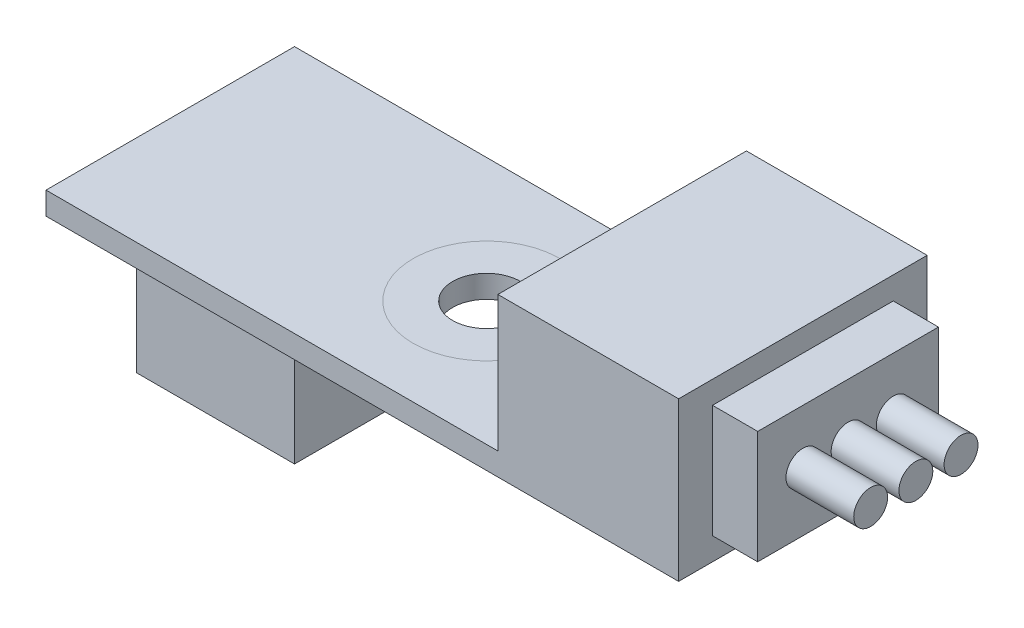
ISO-10303-21;
HEADER;
FILE_DESCRIPTION(('STEP AP214'),'2;1');
FILE_NAME('part.step','',(''),(''),'','','');
FILE_SCHEMA(('AUTOMOTIVE_DESIGN { 1 0 10303 214 1 1 1 1 }'));
ENDSEC;
DATA;
#1=APPLICATION_CONTEXT('core data for automotive mechanical design processes');
#2=APPLICATION_PROTOCOL_DEFINITION('international standard','automotive_design',2000,#1);
#3=PRODUCT_CONTEXT('',#1,'mechanical');
#4=PRODUCT('Part','Part','',(#3));
#5=PRODUCT_RELATED_PRODUCT_CATEGORY('part','',(#4));
#6=PRODUCT_DEFINITION_FORMATION('','',#4);
#7=PRODUCT_DEFINITION_CONTEXT('part definition',#1,'design');
#8=PRODUCT_DEFINITION('design','',#6,#7);
#9=PRODUCT_DEFINITION_SHAPE('','',#8);
#10=(LENGTH_UNIT() NAMED_UNIT(*) SI_UNIT(.MILLI.,.METRE.));
#11=(NAMED_UNIT(*) PLANE_ANGLE_UNIT() SI_UNIT($,.RADIAN.));
#12=(NAMED_UNIT(*) SI_UNIT($,.STERADIAN.) SOLID_ANGLE_UNIT());
#13=UNCERTAINTY_MEASURE_WITH_UNIT(LENGTH_MEASURE(1.E-05),#10,'distance_accuracy_value','');
#14=(GEOMETRIC_REPRESENTATION_CONTEXT(3) GLOBAL_UNCERTAINTY_ASSIGNED_CONTEXT((#13)) GLOBAL_UNIT_ASSIGNED_CONTEXT((#10,
#11,#12)) REPRESENTATION_CONTEXT('',''));
#15=CARTESIAN_POINT('',(0.,0.,0.));
#16=DIRECTION('',(0.,0.,1.));
#17=DIRECTION('',(1.,0.,0.));
#18=AXIS2_PLACEMENT_3D('',#15,#16,#17);
#19=CARTESIAN_POINT('',(14.,1.,0.));
#20=DIRECTION('',(-1.,0.,0.));
#21=DIRECTION('',(0.,0.,1.));
#22=AXIS2_PLACEMENT_3D('',#19,#20,#21);
#23=PLANE('',#22);
#24=DIRECTION('',(0.,0.,-1.));
#25=VECTOR('',#24,1.);
#26=CARTESIAN_POINT('',(14.,0.,0.));
#27=LINE('',#26,#25);
#28=CARTESIAN_POINT('',(14.,0.,5.5));
#29=VERTEX_POINT('',#28);
#30=CARTESIAN_POINT('',(14.,0.,-5.5));
#31=VERTEX_POINT('',#30);
#32=EDGE_CURVE('E263',#29,#31,#27,.T.);
#33=ORIENTED_EDGE('',*,*,#32,.T.);
#34=DIRECTION('',(0.,-1.,0.));
#35=VECTOR('',#34,1.);
#36=CARTESIAN_POINT('',(14.,1.,-5.5));
#37=LINE('',#36,#35);
#38=CARTESIAN_POINT('',(14.,7.,-5.5));
#39=VERTEX_POINT('',#38);
#40=EDGE_CURVE('E283',#39,#31,#37,.T.);
#41=ORIENTED_EDGE('',*,*,#40,.F.);
#42=DIRECTION('',(0.,0.,1.));
#43=VECTOR('',#42,1.);
#44=CARTESIAN_POINT('',(14.,7.,0.));
#45=LINE('',#44,#43);
#46=CARTESIAN_POINT('',(14.,7.,5.5));
#47=VERTEX_POINT('',#46);
#48=EDGE_CURVE('E185',#39,#47,#45,.T.);
#49=ORIENTED_EDGE('',*,*,#48,.T.);
#50=DIRECTION('',(0.,-1.,0.));
#51=VECTOR('',#50,1.);
#52=CARTESIAN_POINT('',(14.,1.,5.5));
#53=LINE('',#52,#51);
#54=EDGE_CURVE('E286',#47,#29,#53,.T.);
#55=ORIENTED_EDGE('',*,*,#54,.T.);
#56=EDGE_LOOP('',(#33,#41,#49,#55));
#57=FACE_BOUND('',#56,.T.);
#58=DIRECTION('',(0.,-1.,0.));
#59=VECTOR('',#58,1.);
#60=CARTESIAN_POINT('',(14.,6.,4.));
#61=LINE('',#60,#59);
#62=CARTESIAN_POINT('',(14.,6.,4.));
#63=VERTEX_POINT('',#62);
#64=CARTESIAN_POINT('',(14.,0.999999999999999,4.));
#65=VERTEX_POINT('',#64);
#66=EDGE_CURVE('E59',#63,#65,#61,.T.);
#67=ORIENTED_EDGE('',*,*,#66,.F.);
#68=DIRECTION('',(0.,0.,1.));
#69=VECTOR('',#68,1.);
#70=CARTESIAN_POINT('',(14.,6.,-4.));
#71=LINE('',#70,#69);
#72=CARTESIAN_POINT('',(14.,6.,-4.));
#73=VERTEX_POINT('',#72);
#74=EDGE_CURVE('E63',#73,#63,#71,.T.);
#75=ORIENTED_EDGE('',*,*,#74,.F.);
#76=DIRECTION('',(0.,1.,0.));
#77=VECTOR('',#76,1.);
#78=CARTESIAN_POINT('',(14.,6.,-4.));
#79=LINE('',#78,#77);
#80=CARTESIAN_POINT('',(14.,1.,-4.));
#81=VERTEX_POINT('',#80);
#82=EDGE_CURVE('E398',#81,#73,#79,.T.);
#83=ORIENTED_EDGE('',*,*,#82,.F.);
#84=DIRECTION('',(0.,0.,-1.));
#85=VECTOR('',#84,1.);
#86=CARTESIAN_POINT('',(14.,1.,-4.));
#87=LINE('',#86,#85);
#88=EDGE_CURVE('E408',#65,#81,#87,.T.);
#89=ORIENTED_EDGE('',*,*,#88,.F.);
#90=EDGE_LOOP('',(#67,#75,#83,#89));
#91=FACE_BOUND('',#90,.T.);
#92=ADVANCED_FACE('F43',(#57,#91),#23,.F.);
#93=CARTESIAN_POINT('',(0.,0.,0.));
#94=DIRECTION('',(0.,1.,0.));
#95=DIRECTION('',(0.,0.,1.));
#96=AXIS2_PLACEMENT_3D('',#93,#94,#95);
#97=PLANE('',#96);
#98=DIRECTION('',(-1.,0.,0.));
#99=VECTOR('',#98,1.);
#100=CARTESIAN_POINT('',(-6.,0.,2.5));
#101=LINE('',#100,#99);
#102=CARTESIAN_POINT('',(-6.,0.,2.5));
#103=VERTEX_POINT('',#102);
#104=CARTESIAN_POINT('',(-13.,0.,2.5));
#105=VERTEX_POINT('',#104);
#106=EDGE_CURVE('E205',#103,#105,#101,.T.);
#107=ORIENTED_EDGE('',*,*,#106,.F.);
#108=DIRECTION('',(0.,0.,-1.));
#109=VECTOR('',#108,1.);
#110=CARTESIAN_POINT('',(-6.,0.,2.5));
#111=LINE('',#110,#109);
#112=CARTESIAN_POINT('',(-6.,0.,-2.5));
#113=VERTEX_POINT('',#112);
#114=EDGE_CURVE('E197',#103,#113,#111,.T.);
#115=ORIENTED_EDGE('',*,*,#114,.T.);
#116=DIRECTION('',(-1.,0.,0.));
#117=VECTOR('',#116,1.);
#118=CARTESIAN_POINT('',(-6.,0.,-2.5));
#119=LINE('',#118,#117);
#120=CARTESIAN_POINT('',(-13.,0.,-2.5));
#121=VERTEX_POINT('',#120);
#122=EDGE_CURVE('E219',#113,#121,#119,.T.);
#123=ORIENTED_EDGE('',*,*,#122,.T.);
#124=DIRECTION('',(0.,0.,-1.));
#125=VECTOR('',#124,1.);
#126=CARTESIAN_POINT('',(-13.,0.,2.5));
#127=LINE('',#126,#125);
#128=EDGE_CURVE('E223',#105,#121,#127,.T.);
#129=ORIENTED_EDGE('',*,*,#128,.F.);
#130=EDGE_LOOP('',(#107,#115,#123,#129));
#131=FACE_BOUND('',#130,.T.);
#132=DIRECTION('',(1.,0.,0.));
#133=VECTOR('',#132,1.);
#134=CARTESIAN_POINT('',(0.,0.,5.5));
#135=LINE('',#134,#133);
#136=CARTESIAN_POINT('',(-14.,0.,5.5));
#137=VERTEX_POINT('',#136);
#138=EDGE_CURVE('E231',#137,#29,#135,.T.);
#139=ORIENTED_EDGE('',*,*,#138,.F.);
#140=DIRECTION('',(0.,0.,-1.));
#141=VECTOR('',#140,1.);
#142=CARTESIAN_POINT('',(-14.,0.,0.));
#143=LINE('',#142,#141);
#144=CARTESIAN_POINT('',(-14.,0.,-5.5));
#145=VERTEX_POINT('',#144);
#146=EDGE_CURVE('E271',#137,#145,#143,.T.);
#147=ORIENTED_EDGE('',*,*,#146,.T.);
#148=DIRECTION('',(1.,0.,0.));
#149=VECTOR('',#148,1.);
#150=CARTESIAN_POINT('',(0.,0.,-5.5));
#151=LINE('',#150,#149);
#152=EDGE_CURVE('E267',#145,#31,#151,.T.);
#153=ORIENTED_EDGE('',*,*,#152,.T.);
#154=ORIENTED_EDGE('',*,*,#32,.F.);
#155=EDGE_LOOP('',(#139,#147,#153,#154));
#156=FACE_BOUND('',#155,.T.);
#157=CARTESIAN_POINT('',(0.,0.,0.));
#158=DIRECTION('',(0.,1.,0.));
#159=DIRECTION('',(0.,0.,1.));
#160=AXIS2_PLACEMENT_3D('',#157,#158,#159);
#161=CIRCLE('',#160,3.25);
#162=CARTESIAN_POINT('',(0.,0.,3.25));
#163=VERTEX_POINT('',#162);
#164=EDGE_CURVE('E291',#163,#163,#161,.F.);
#165=ORIENTED_EDGE('',*,*,#164,.F.);
#166=EDGE_LOOP('',(#165));
#167=FACE_BOUND('',#166,.T.);
#168=ADVANCED_FACE('F326',(#131,#156,#167),#97,.F.);
#169=CARTESIAN_POINT('',(0.,1.,0.));
#170=DIRECTION('',(0.,1.,0.));
#171=DIRECTION('',(0.,0.,1.));
#172=AXIS2_PLACEMENT_3D('',#169,#170,#171);
#173=PLANE('',#172);
#174=DIRECTION('',(0.,0.,-1.));
#175=VECTOR('',#174,1.);
#176=CARTESIAN_POINT('',(6.,1.,0.));
#177=LINE('',#176,#175);
#178=CARTESIAN_POINT('',(6.,1.,5.5));
#179=VERTEX_POINT('',#178);
#180=CARTESIAN_POINT('',(6.,1.,-5.5));
#181=VERTEX_POINT('',#180);
#182=EDGE_CURVE('E168',#179,#181,#177,.T.);
#183=ORIENTED_EDGE('',*,*,#182,.T.);
#184=DIRECTION('',(1.,0.,0.));
#185=VECTOR('',#184,1.);
#186=CARTESIAN_POINT('',(0.,1.,-5.5));
#187=LINE('',#186,#185);
#188=CARTESIAN_POINT('',(-14.,1.,-5.5));
#189=VERTEX_POINT('',#188);
#190=EDGE_CURVE('E246',#189,#181,#187,.T.);
#191=ORIENTED_EDGE('',*,*,#190,.F.);
#192=DIRECTION('',(0.,0.,-1.));
#193=VECTOR('',#192,1.);
#194=CARTESIAN_POINT('',(-14.,1.,0.));
#195=LINE('',#194,#193);
#196=CARTESIAN_POINT('',(-14.,1.,5.5));
#197=VERTEX_POINT('',#196);
#198=EDGE_CURVE('E251',#197,#189,#195,.T.);
#199=ORIENTED_EDGE('',*,*,#198,.F.);
#200=DIRECTION('',(1.,0.,0.));
#201=VECTOR('',#200,1.);
#202=CARTESIAN_POINT('',(0.,1.,5.5));
#203=LINE('',#202,#201);
#204=EDGE_CURVE('E242',#197,#179,#203,.T.);
#205=ORIENTED_EDGE('',*,*,#204,.T.);
#206=EDGE_LOOP('',(#183,#191,#199,#205));
#207=FACE_BOUND('',#206,.T.);
#208=CARTESIAN_POINT('',(0.,1.,0.));
#209=DIRECTION('',(0.,1.,0.));
#210=DIRECTION('',(0.,0.,1.));
#211=AXIS2_PLACEMENT_3D('',#208,#209,#210);
#212=CIRCLE('',#211,3.25);
#213=CARTESIAN_POINT('',(0.,1.,3.25));
#214=VERTEX_POINT('',#213);
#215=EDGE_CURVE('E290',#214,#214,#212,.F.);
#216=ORIENTED_EDGE('',*,*,#215,.T.);
#217=EDGE_LOOP('',(#216));
#218=FACE_BOUND('',#217,.T.);
#219=ADVANCED_FACE('F331',(#207,#218),#173,.T.);
#220=CARTESIAN_POINT('',(0.,1.,5.5));
#221=DIRECTION('',(0.,0.,-1.));
#222=DIRECTION('',(-1.,0.,0.));
#223=AXIS2_PLACEMENT_3D('',#220,#221,#222);
#224=PLANE('',#223);
#225=ORIENTED_EDGE('',*,*,#138,.T.);
#226=ORIENTED_EDGE('',*,*,#54,.F.);
#227=DIRECTION('',(-1.,0.,0.));
#228=VECTOR('',#227,1.);
#229=CARTESIAN_POINT('',(0.,7.,5.5));
#230=LINE('',#229,#228);
#231=CARTESIAN_POINT('',(6.,7.,5.5));
#232=VERTEX_POINT('',#231);
#233=EDGE_CURVE('E189',#47,#232,#230,.T.);
#234=ORIENTED_EDGE('',*,*,#233,.T.);
#235=DIRECTION('',(0.,-1.,0.));
#236=VECTOR('',#235,1.);
#237=CARTESIAN_POINT('',(6.,7.,5.5));
#238=LINE('',#237,#236);
#239=EDGE_CURVE('E194',#232,#179,#238,.T.);
#240=ORIENTED_EDGE('',*,*,#239,.T.);
#241=ORIENTED_EDGE('',*,*,#204,.F.);
#242=DIRECTION('',(0.,-1.,0.));
#243=VECTOR('',#242,1.);
#244=CARTESIAN_POINT('',(-14.,1.,5.5));
#245=LINE('',#244,#243);
#246=EDGE_CURVE('E259',#197,#137,#245,.T.);
#247=ORIENTED_EDGE('',*,*,#246,.T.);
#248=EDGE_LOOP('',(#225,#226,#234,#240,#241,#247));
#249=FACE_BOUND('',#248,.T.);
#250=ADVANCED_FACE('F45',(#249),#224,.F.);
#251=CARTESIAN_POINT('',(0.,1.,-5.5));
#252=DIRECTION('',(0.,0.,-1.));
#253=DIRECTION('',(-1.,0.,0.));
#254=AXIS2_PLACEMENT_3D('',#251,#252,#253);
#255=PLANE('',#254);
#256=ORIENTED_EDGE('',*,*,#152,.F.);
#257=DIRECTION('',(0.,-1.,0.));
#258=VECTOR('',#257,1.);
#259=CARTESIAN_POINT('',(-14.,1.,-5.5));
#260=LINE('',#259,#258);
#261=EDGE_CURVE('E280',#189,#145,#260,.T.);
#262=ORIENTED_EDGE('',*,*,#261,.F.);
#263=ORIENTED_EDGE('',*,*,#190,.T.);
#264=DIRECTION('',(0.,-1.,0.));
#265=VECTOR('',#264,1.);
#266=CARTESIAN_POINT('',(6.,7.,-5.5));
#267=LINE('',#266,#265);
#268=CARTESIAN_POINT('',(6.,7.,-5.5));
#269=VERTEX_POINT('',#268);
#270=EDGE_CURVE('E192',#269,#181,#267,.T.);
#271=ORIENTED_EDGE('',*,*,#270,.F.);
#272=DIRECTION('',(-1.,0.,0.));
#273=VECTOR('',#272,1.);
#274=CARTESIAN_POINT('',(0.,7.,-5.5));
#275=LINE('',#274,#273);
#276=EDGE_CURVE('E182',#39,#269,#275,.T.);
#277=ORIENTED_EDGE('',*,*,#276,.F.);
#278=ORIENTED_EDGE('',*,*,#40,.T.);
#279=EDGE_LOOP('',(#256,#262,#263,#271,#277,#278));
#280=FACE_BOUND('',#279,.T.);
#281=ADVANCED_FACE('F336',(#280),#255,.T.);
#282=CARTESIAN_POINT('',(-14.,1.,0.));
#283=DIRECTION('',(-1.,0.,0.));
#284=DIRECTION('',(0.,0.,1.));
#285=AXIS2_PLACEMENT_3D('',#282,#283,#284);
#286=PLANE('',#285);
#287=ORIENTED_EDGE('',*,*,#146,.F.);
#288=ORIENTED_EDGE('',*,*,#246,.F.);
#289=ORIENTED_EDGE('',*,*,#198,.T.);
#290=ORIENTED_EDGE('',*,*,#261,.T.);
#291=EDGE_LOOP('',(#287,#288,#289,#290));
#292=FACE_BOUND('',#291,.T.);
#293=ADVANCED_FACE('F339',(#292),#286,.T.);
#294=CARTESIAN_POINT('',(0.,1.,0.));
#295=DIRECTION('',(0.,-1.,0.));
#296=DIRECTION('',(0.,0.,-1.));
#297=AXIS2_PLACEMENT_3D('',#294,#295,#296);
#298=CYLINDRICAL_SURFACE('',#297,1.5);
#299=CARTESIAN_POINT('',(0.,1.,0.));
#300=DIRECTION('',(0.,1.,0.));
#301=DIRECTION('',(0.,0.,1.));
#302=AXIS2_PLACEMENT_3D('',#299,#300,#301);
#303=CIRCLE('',#302,1.5);
#304=CARTESIAN_POINT('',(0.,1.,1.5));
#305=VERTEX_POINT('',#304);
#306=EDGE_CURVE('E255',#305,#305,#303,.T.);
#307=ORIENTED_EDGE('',*,*,#306,.T.);
#308=EDGE_LOOP('',(#307));
#309=FACE_BOUND('',#308,.T.);
#310=CARTESIAN_POINT('',(0.,0.,0.));
#311=DIRECTION('',(0.,1.,0.));
#312=DIRECTION('',(0.,0.,1.));
#313=AXIS2_PLACEMENT_3D('',#310,#311,#312);
#314=CIRCLE('',#313,1.5);
#315=CARTESIAN_POINT('',(0.,0.,1.5));
#316=VERTEX_POINT('',#315);
#317=EDGE_CURVE('E247',#316,#316,#314,.T.);
#318=ORIENTED_EDGE('',*,*,#317,.F.);
#319=EDGE_LOOP('',(#318));
#320=FACE_BOUND('',#319,.T.);
#321=ADVANCED_FACE('F343',(#309,#320),#298,.F.);
#322=ORIENTED_EDGE('',*,*,#215,.F.);
#323=EDGE_LOOP('',(#322));
#324=FACE_BOUND('',#323,.T.);
#325=ORIENTED_EDGE('',*,*,#306,.F.);
#326=EDGE_LOOP('',(#325));
#327=FACE_BOUND('',#326,.T.);
#328=ADVANCED_FACE('F346',(#324,#327),#173,.T.);
#329=ORIENTED_EDGE('',*,*,#164,.T.);
#330=EDGE_LOOP('',(#329));
#331=FACE_BOUND('',#330,.T.);
#332=ORIENTED_EDGE('',*,*,#317,.T.);
#333=EDGE_LOOP('',(#332));
#334=FACE_BOUND('',#333,.T.);
#335=ADVANCED_FACE('F334',(#331,#334),#97,.F.);
#336=CARTESIAN_POINT('',(-6.,-7.,2.5));
#337=DIRECTION('',(1.,0.,0.));
#338=DIRECTION('',(0.,0.,-1.));
#339=AXIS2_PLACEMENT_3D('',#336,#337,#338);
#340=PLANE('',#339);
#341=ORIENTED_EDGE('',*,*,#114,.F.);
#342=DIRECTION('',(0.,1.,0.));
#343=VECTOR('',#342,1.);
#344=CARTESIAN_POINT('',(-6.,-7.,2.5));
#345=LINE('',#344,#343);
#346=CARTESIAN_POINT('',(-6.,-7.,2.5));
#347=VERTEX_POINT('',#346);
#348=EDGE_CURVE('E228',#347,#103,#345,.T.);
#349=ORIENTED_EDGE('',*,*,#348,.F.);
#350=DIRECTION('',(0.,0.,-1.));
#351=VECTOR('',#350,1.);
#352=CARTESIAN_POINT('',(-6.,-7.,2.5));
#353=LINE('',#352,#351);
#354=CARTESIAN_POINT('',(-6.,-7.,-2.5));
#355=VERTEX_POINT('',#354);
#356=EDGE_CURVE('E200',#347,#355,#353,.T.);
#357=ORIENTED_EDGE('',*,*,#356,.T.);
#358=DIRECTION('',(0.,1.,0.));
#359=VECTOR('',#358,1.);
#360=CARTESIAN_POINT('',(-6.,-7.,-2.5));
#361=LINE('',#360,#359);
#362=EDGE_CURVE('E215',#355,#113,#361,.T.);
#363=ORIENTED_EDGE('',*,*,#362,.T.);
#364=EDGE_LOOP('',(#341,#349,#357,#363));
#365=FACE_BOUND('',#364,.T.);
#366=ADVANCED_FACE('F350',(#365),#340,.T.);
#367=CARTESIAN_POINT('',(-6.,-7.,2.5));
#368=DIRECTION('',(0.,0.,-1.));
#369=DIRECTION('',(-1.,0.,0.));
#370=AXIS2_PLACEMENT_3D('',#367,#368,#369);
#371=PLANE('',#370);
#372=ORIENTED_EDGE('',*,*,#106,.T.);
#373=DIRECTION('',(0.,1.,0.));
#374=VECTOR('',#373,1.);
#375=CARTESIAN_POINT('',(-13.,-7.,2.5));
#376=LINE('',#375,#374);
#377=CARTESIAN_POINT('',(-13.,-7.,2.5));
#378=VERTEX_POINT('',#377);
#379=EDGE_CURVE('E232',#378,#105,#376,.T.);
#380=ORIENTED_EDGE('',*,*,#379,.F.);
#381=DIRECTION('',(-1.,0.,0.));
#382=VECTOR('',#381,1.);
#383=CARTESIAN_POINT('',(-6.,-7.,2.5));
#384=LINE('',#383,#382);
#385=EDGE_CURVE('E212',#347,#378,#384,.T.);
#386=ORIENTED_EDGE('',*,*,#385,.F.);
#387=ORIENTED_EDGE('',*,*,#348,.T.);
#388=EDGE_LOOP('',(#372,#380,#386,#387));
#389=FACE_BOUND('',#388,.T.);
#390=ADVANCED_FACE('F357',(#389),#371,.F.);
#391=CARTESIAN_POINT('',(-13.,-7.,2.5));
#392=DIRECTION('',(1.,0.,0.));
#393=DIRECTION('',(0.,0.,-1.));
#394=AXIS2_PLACEMENT_3D('',#391,#392,#393);
#395=PLANE('',#394);
#396=ORIENTED_EDGE('',*,*,#128,.T.);
#397=DIRECTION('',(0.,1.,0.));
#398=VECTOR('',#397,1.);
#399=CARTESIAN_POINT('',(-13.,-7.,-2.5));
#400=LINE('',#399,#398);
#401=CARTESIAN_POINT('',(-13.,-7.,-2.5));
#402=VERTEX_POINT('',#401);
#403=EDGE_CURVE('E236',#402,#121,#400,.T.);
#404=ORIENTED_EDGE('',*,*,#403,.F.);
#405=DIRECTION('',(0.,0.,-1.));
#406=VECTOR('',#405,1.);
#407=CARTESIAN_POINT('',(-13.,-7.,2.5));
#408=LINE('',#407,#406);
#409=EDGE_CURVE('E209',#378,#402,#408,.T.);
#410=ORIENTED_EDGE('',*,*,#409,.F.);
#411=ORIENTED_EDGE('',*,*,#379,.T.);
#412=EDGE_LOOP('',(#396,#404,#410,#411));
#413=FACE_BOUND('',#412,.T.);
#414=ADVANCED_FACE('F363',(#413),#395,.F.);
#415=CARTESIAN_POINT('',(-6.,-7.,-2.5));
#416=DIRECTION('',(0.,0.,-1.));
#417=DIRECTION('',(-1.,0.,0.));
#418=AXIS2_PLACEMENT_3D('',#415,#416,#417);
#419=PLANE('',#418);
#420=ORIENTED_EDGE('',*,*,#122,.F.);
#421=ORIENTED_EDGE('',*,*,#362,.F.);
#422=DIRECTION('',(-1.,0.,0.));
#423=VECTOR('',#422,1.);
#424=CARTESIAN_POINT('',(-6.,-7.,-2.5));
#425=LINE('',#424,#423);
#426=EDGE_CURVE('E204',#355,#402,#425,.T.);
#427=ORIENTED_EDGE('',*,*,#426,.T.);
#428=ORIENTED_EDGE('',*,*,#403,.T.);
#429=EDGE_LOOP('',(#420,#421,#427,#428));
#430=FACE_BOUND('',#429,.T.);
#431=ADVANCED_FACE('F359',(#430),#419,.T.);
#432=CARTESIAN_POINT('',(0.,-7.,0.));
#433=DIRECTION('',(0.,1.,0.));
#434=DIRECTION('',(0.,0.,1.));
#435=AXIS2_PLACEMENT_3D('',#432,#433,#434);
#436=PLANE('',#435);
#437=ORIENTED_EDGE('',*,*,#356,.F.);
#438=ORIENTED_EDGE('',*,*,#385,.T.);
#439=ORIENTED_EDGE('',*,*,#409,.T.);
#440=ORIENTED_EDGE('',*,*,#426,.F.);
#441=EDGE_LOOP('',(#437,#438,#439,#440));
#442=FACE_BOUND('',#441,.T.);
#443=ADVANCED_FACE('F362',(#442),#436,.F.);
#444=CARTESIAN_POINT('',(6.,7.,0.));
#445=DIRECTION('',(-1.,0.,0.));
#446=DIRECTION('',(0.,0.,1.));
#447=AXIS2_PLACEMENT_3D('',#444,#445,#446);
#448=PLANE('',#447);
#449=ORIENTED_EDGE('',*,*,#182,.F.);
#450=ORIENTED_EDGE('',*,*,#239,.F.);
#451=DIRECTION('',(0.,0.,-1.));
#452=VECTOR('',#451,1.);
#453=CARTESIAN_POINT('',(6.,7.,0.));
#454=LINE('',#453,#452);
#455=EDGE_CURVE('E173',#232,#269,#454,.T.);
#456=ORIENTED_EDGE('',*,*,#455,.T.);
#457=ORIENTED_EDGE('',*,*,#270,.T.);
#458=EDGE_LOOP('',(#449,#450,#456,#457));
#459=FACE_BOUND('',#458,.T.);
#460=ADVANCED_FACE('F373',(#459),#448,.T.);
#461=CARTESIAN_POINT('',(0.,7.,0.));
#462=DIRECTION('',(0.,1.,0.));
#463=DIRECTION('',(0.,0.,1.));
#464=AXIS2_PLACEMENT_3D('',#461,#462,#463);
#465=PLANE('',#464);
#466=ORIENTED_EDGE('',*,*,#455,.F.);
#467=ORIENTED_EDGE('',*,*,#233,.F.);
#468=ORIENTED_EDGE('',*,*,#48,.F.);
#469=ORIENTED_EDGE('',*,*,#276,.T.);
#470=EDGE_LOOP('',(#466,#467,#468,#469));
#471=FACE_BOUND('',#470,.T.);
#472=ADVANCED_FACE('F377',(#471),#465,.T.);
#473=CARTESIAN_POINT('',(16.,6.,4.));
#474=DIRECTION('',(0.,0.,-1.));
#475=DIRECTION('',(0.,1.,0.));
#476=AXIS2_PLACEMENT_3D('',#473,#474,#475);
#477=PLANE('',#476);
#478=ORIENTED_EDGE('',*,*,#66,.T.);
#479=DIRECTION('',(-1.,0.,0.));
#480=VECTOR('',#479,1.);
#481=CARTESIAN_POINT('',(16.,0.999999999999999,4.));
#482=LINE('',#481,#480);
#483=CARTESIAN_POINT('',(16.,0.999999999999999,4.));
#484=VERTEX_POINT('',#483);
#485=EDGE_CURVE('E148',#484,#65,#482,.T.);
#486=ORIENTED_EDGE('',*,*,#485,.F.);
#487=DIRECTION('',(0.,-1.,0.));
#488=VECTOR('',#487,1.);
#489=CARTESIAN_POINT('',(16.,6.,4.));
#490=LINE('',#489,#488);
#491=CARTESIAN_POINT('',(16.,6.,4.));
#492=VERTEX_POINT('',#491);
#493=EDGE_CURVE('E155',#492,#484,#490,.T.);
#494=ORIENTED_EDGE('',*,*,#493,.F.);
#495=DIRECTION('',(-1.,0.,0.));
#496=VECTOR('',#495,1.);
#497=CARTESIAN_POINT('',(16.,6.,4.));
#498=LINE('',#497,#496);
#499=EDGE_CURVE('E395',#492,#63,#498,.T.);
#500=ORIENTED_EDGE('',*,*,#499,.T.);
#501=EDGE_LOOP('',(#478,#486,#494,#500));
#502=FACE_BOUND('',#501,.T.);
#503=ADVANCED_FACE('F166',(#502),#477,.F.);
#504=CARTESIAN_POINT('',(16.,1.,-4.));
#505=DIRECTION('',(0.,1.,0.));
#506=DIRECTION('',(0.,0.,1.));
#507=AXIS2_PLACEMENT_3D('',#504,#505,#506);
#508=PLANE('',#507);
#509=ORIENTED_EDGE('',*,*,#88,.T.);
#510=DIRECTION('',(-1.,0.,0.));
#511=VECTOR('',#510,1.);
#512=CARTESIAN_POINT('',(16.,1.,-4.));
#513=LINE('',#512,#511);
#514=CARTESIAN_POINT('',(16.,1.,-4.));
#515=VERTEX_POINT('',#514);
#516=EDGE_CURVE('E150',#515,#81,#513,.T.);
#517=ORIENTED_EDGE('',*,*,#516,.F.);
#518=DIRECTION('',(0.,0.,-1.));
#519=VECTOR('',#518,1.);
#520=CARTESIAN_POINT('',(16.,1.,-4.));
#521=LINE('',#520,#519);
#522=EDGE_CURVE('E143',#484,#515,#521,.T.);
#523=ORIENTED_EDGE('',*,*,#522,.F.);
#524=ORIENTED_EDGE('',*,*,#485,.T.);
#525=EDGE_LOOP('',(#509,#517,#523,#524));
#526=FACE_BOUND('',#525,.T.);
#527=ADVANCED_FACE('F146',(#526),#508,.F.);
#528=CARTESIAN_POINT('',(16.,6.,-4.));
#529=DIRECTION('',(0.,0.,1.));
#530=DIRECTION('',(0.,-1.,0.));
#531=AXIS2_PLACEMENT_3D('',#528,#529,#530);
#532=PLANE('',#531);
#533=ORIENTED_EDGE('',*,*,#82,.T.);
#534=DIRECTION('',(-1.,0.,0.));
#535=VECTOR('',#534,1.);
#536=CARTESIAN_POINT('',(16.,6.,-4.));
#537=LINE('',#536,#535);
#538=CARTESIAN_POINT('',(16.,6.,-4.));
#539=VERTEX_POINT('',#538);
#540=EDGE_CURVE('E175',#539,#73,#537,.T.);
#541=ORIENTED_EDGE('',*,*,#540,.F.);
#542=DIRECTION('',(0.,1.,0.));
#543=VECTOR('',#542,1.);
#544=CARTESIAN_POINT('',(16.,6.,-4.));
#545=LINE('',#544,#543);
#546=EDGE_CURVE('E154',#515,#539,#545,.T.);
#547=ORIENTED_EDGE('',*,*,#546,.F.);
#548=ORIENTED_EDGE('',*,*,#516,.T.);
#549=EDGE_LOOP('',(#533,#541,#547,#548));
#550=FACE_BOUND('',#549,.T.);
#551=ADVANCED_FACE('F386',(#550),#532,.F.);
#552=CARTESIAN_POINT('',(16.,6.,-4.));
#553=DIRECTION('',(0.,-1.,0.));
#554=DIRECTION('',(0.,0.,-1.));
#555=AXIS2_PLACEMENT_3D('',#552,#553,#554);
#556=PLANE('',#555);
#557=ORIENTED_EDGE('',*,*,#74,.T.);
#558=ORIENTED_EDGE('',*,*,#499,.F.);
#559=DIRECTION('',(0.,0.,1.));
#560=VECTOR('',#559,1.);
#561=CARTESIAN_POINT('',(16.,6.,-4.));
#562=LINE('',#561,#560);
#563=EDGE_CURVE('E160',#539,#492,#562,.T.);
#564=ORIENTED_EDGE('',*,*,#563,.F.);
#565=ORIENTED_EDGE('',*,*,#540,.T.);
#566=EDGE_LOOP('',(#557,#558,#564,#565));
#567=FACE_BOUND('',#566,.T.);
#568=ADVANCED_FACE('F310',(#567),#556,.F.);
#569=CARTESIAN_POINT('',(16.,0.,0.));
#570=DIRECTION('',(-1.,0.,0.));
#571=DIRECTION('',(0.,0.,1.));
#572=AXIS2_PLACEMENT_3D('',#569,#570,#571);
#573=PLANE('',#572);
#574=CARTESIAN_POINT('',(16.,3.60383868861963,-2.));
#575=DIRECTION('',(-1.,0.,0.));
#576=DIRECTION('',(0.,0.,1.));
#577=AXIS2_PLACEMENT_3D('',#574,#575,#576);
#578=CIRCLE('',#577,0.75);
#579=CARTESIAN_POINT('',(16.,3.60383868861963,-1.25));
#580=VERTEX_POINT('',#579);
#581=EDGE_CURVE('E11',#580,#580,#578,.F.);
#582=ORIENTED_EDGE('',*,*,#581,.F.);
#583=EDGE_LOOP('',(#582));
#584=FACE_BOUND('',#583,.T.);
#585=CARTESIAN_POINT('',(16.,3.60383868861963,0.));
#586=DIRECTION('',(-1.,0.,0.));
#587=DIRECTION('',(0.,0.,1.));
#588=AXIS2_PLACEMENT_3D('',#585,#586,#587);
#589=CIRCLE('',#588,0.75);
#590=CARTESIAN_POINT('',(16.,3.60383868861963,0.75));
#591=VERTEX_POINT('',#590);
#592=EDGE_CURVE('E52',#591,#591,#589,.F.);
#593=ORIENTED_EDGE('',*,*,#592,.F.);
#594=EDGE_LOOP('',(#593));
#595=FACE_BOUND('',#594,.T.);
#596=CARTESIAN_POINT('',(16.,3.60383868861963,2.));
#597=DIRECTION('',(-1.,0.,0.));
#598=DIRECTION('',(0.,0.,1.));
#599=AXIS2_PLACEMENT_3D('',#596,#597,#598);
#600=CIRCLE('',#599,0.75);
#601=CARTESIAN_POINT('',(16.,3.60383868861963,2.75));
#602=VERTEX_POINT('',#601);
#603=EDGE_CURVE('E295',#602,#602,#600,.F.);
#604=ORIENTED_EDGE('',*,*,#603,.F.);
#605=EDGE_LOOP('',(#604));
#606=FACE_BOUND('',#605,.T.);
#607=ORIENTED_EDGE('',*,*,#493,.T.);
#608=ORIENTED_EDGE('',*,*,#522,.T.);
#609=ORIENTED_EDGE('',*,*,#546,.T.);
#610=ORIENTED_EDGE('',*,*,#563,.T.);
#611=EDGE_LOOP('',(#607,#608,#609,#610));
#612=FACE_BOUND('',#611,.T.);
#613=ADVANCED_FACE('F158',(#584,#595,#606,#612),#573,.F.);
#614=CARTESIAN_POINT('',(19.,3.60383868861963,2.));
#615=DIRECTION('',(-1.,0.,0.));
#616=DIRECTION('',(0.,0.,1.));
#617=AXIS2_PLACEMENT_3D('',#614,#615,#616);
#618=CYLINDRICAL_SURFACE('',#617,0.75);
#619=CARTESIAN_POINT('',(19.,3.60383868861963,2.));
#620=DIRECTION('',(1.,0.,0.));
#621=DIRECTION('',(0.,0.,-1.));
#622=AXIS2_PLACEMENT_3D('',#619,#620,#621);
#623=CIRCLE('',#622,0.75);
#624=CARTESIAN_POINT('',(19.,3.60383868861963,1.25));
#625=VERTEX_POINT('',#624);
#626=EDGE_CURVE('E412',#625,#625,#623,.T.);
#627=ORIENTED_EDGE('',*,*,#626,.F.);
#628=EDGE_LOOP('',(#627));
#629=FACE_BOUND('',#628,.T.);
#630=ORIENTED_EDGE('',*,*,#603,.T.);
#631=EDGE_LOOP('',(#630));
#632=FACE_BOUND('',#631,.T.);
#633=ADVANCED_FACE('F309',(#629,#632),#618,.T.);
#634=CARTESIAN_POINT('',(19.,3.60383868861963,2.));
#635=DIRECTION('',(1.,0.,0.));
#636=DIRECTION('',(0.,0.,-1.));
#637=AXIS2_PLACEMENT_3D('',#634,#635,#636);
#638=PLANE('',#637);
#639=ORIENTED_EDGE('',*,*,#626,.T.);
#640=EDGE_LOOP('',(#639));
#641=FACE_BOUND('',#640,.T.);
#642=ADVANCED_FACE('F316',(#641),#638,.T.);
#643=CARTESIAN_POINT('',(19.,3.60383868861963,0.));
#644=DIRECTION('',(-1.,0.,0.));
#645=DIRECTION('',(0.,0.,1.));
#646=AXIS2_PLACEMENT_3D('',#643,#644,#645);
#647=CYLINDRICAL_SURFACE('',#646,0.75);
#648=CARTESIAN_POINT('',(19.,3.60383868861963,0.));
#649=DIRECTION('',(1.,0.,0.));
#650=DIRECTION('',(0.,0.,-1.));
#651=AXIS2_PLACEMENT_3D('',#648,#649,#650);
#652=CIRCLE('',#651,0.75);
#653=CARTESIAN_POINT('',(19.,3.60383868861963,-0.75));
#654=VERTEX_POINT('',#653);
#655=EDGE_CURVE('E419',#654,#654,#652,.T.);
#656=ORIENTED_EDGE('',*,*,#655,.F.);
#657=EDGE_LOOP('',(#656));
#658=FACE_BOUND('',#657,.T.);
#659=ORIENTED_EDGE('',*,*,#592,.T.);
#660=EDGE_LOOP('',(#659));
#661=FACE_BOUND('',#660,.T.);
#662=ADVANCED_FACE('F305',(#658,#661),#647,.T.);
#663=CARTESIAN_POINT('',(19.,3.60383868861963,0.));
#664=DIRECTION('',(1.,0.,0.));
#665=DIRECTION('',(0.,0.,-1.));
#666=AXIS2_PLACEMENT_3D('',#663,#664,#665);
#667=PLANE('',#666);
#668=ORIENTED_EDGE('',*,*,#655,.T.);
#669=EDGE_LOOP('',(#668));
#670=FACE_BOUND('',#669,.T.);
#671=ADVANCED_FACE('F433',(#670),#667,.T.);
#672=CARTESIAN_POINT('',(19.,3.60383868861963,-2.));
#673=DIRECTION('',(-1.,0.,0.));
#674=DIRECTION('',(0.,0.,1.));
#675=AXIS2_PLACEMENT_3D('',#672,#673,#674);
#676=CYLINDRICAL_SURFACE('',#675,0.75);
#677=CARTESIAN_POINT('',(19.,3.60383868861963,-2.));
#678=DIRECTION('',(1.,0.,0.));
#679=DIRECTION('',(0.,0.,-1.));
#680=AXIS2_PLACEMENT_3D('',#677,#678,#679);
#681=CIRCLE('',#680,0.75);
#682=CARTESIAN_POINT('',(19.,3.60383868861963,-2.75));
#683=VERTEX_POINT('',#682);
#684=EDGE_CURVE('E423',#683,#683,#681,.T.);
#685=ORIENTED_EDGE('',*,*,#684,.F.);
#686=EDGE_LOOP('',(#685));
#687=FACE_BOUND('',#686,.T.);
#688=ORIENTED_EDGE('',*,*,#581,.T.);
#689=EDGE_LOOP('',(#688));
#690=FACE_BOUND('',#689,.T.);
#691=ADVANCED_FACE('F430',(#687,#690),#676,.T.);
#692=CARTESIAN_POINT('',(19.,3.60383868861963,-2.));
#693=DIRECTION('',(1.,0.,0.));
#694=DIRECTION('',(0.,0.,-1.));
#695=AXIS2_PLACEMENT_3D('',#692,#693,#694);
#696=PLANE('',#695);
#697=ORIENTED_EDGE('',*,*,#684,.T.);
#698=EDGE_LOOP('',(#697));
#699=FACE_BOUND('',#698,.T.);
#700=ADVANCED_FACE('F428',(#699),#696,.T.);
#701=CLOSED_SHELL('',(#92,#168,#219,#250,#281,#293,#321,#328,#335,#366,#390,#414,#431,#443,#460,
#472,#503,#527,#551,#568,#613,#633,#642,#662,#671,#691,#700));
#702=MANIFOLD_SOLID_BREP('B2',#701);
#703=ADVANCED_BREP_SHAPE_REPRESENTATION('',(#18,#702),#14);
#704=SHAPE_DEFINITION_REPRESENTATION(#9,#703);
ENDSEC;
END-ISO-10303-21;
